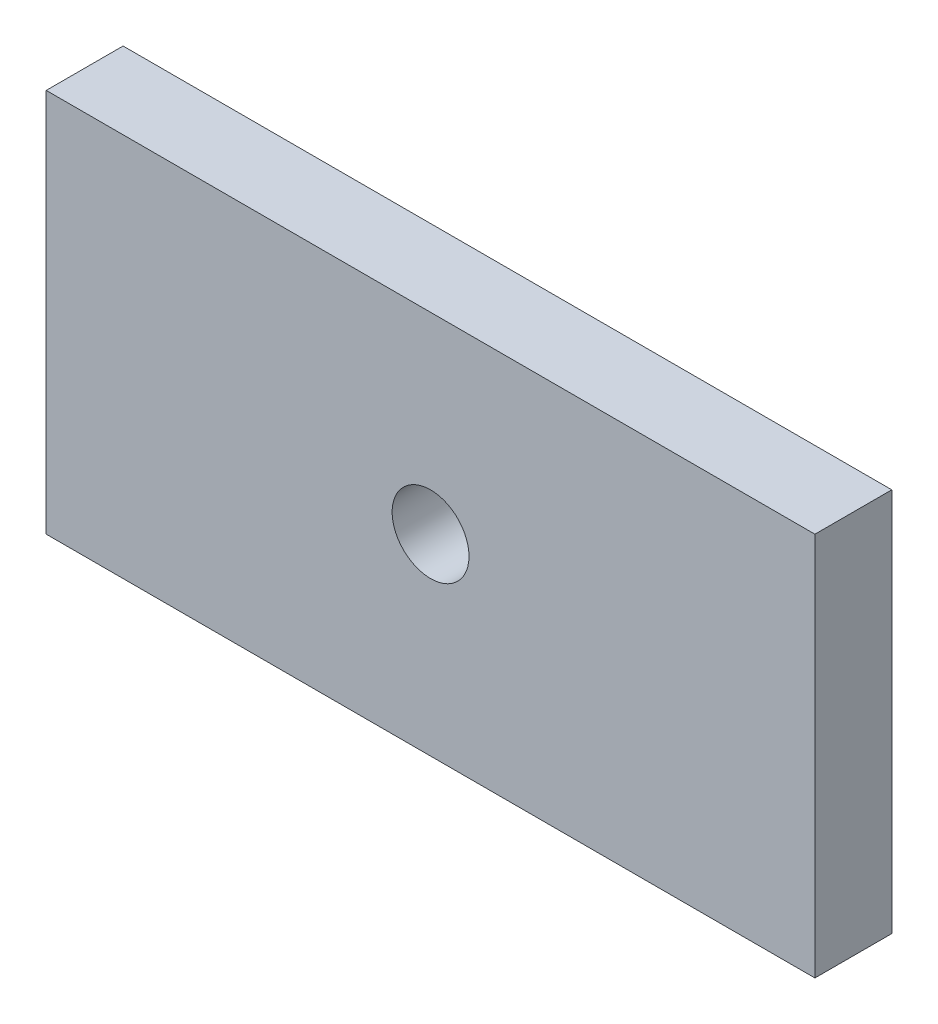
ISO-10303-21;
HEADER;
FILE_DESCRIPTION(('STEP AP214'),'2;1');
FILE_NAME('part.step','',(''),(''),'','','');
FILE_SCHEMA(('AUTOMOTIVE_DESIGN { 1 0 10303 214 1 1 1 1 }'));
ENDSEC;
DATA;
#1=APPLICATION_CONTEXT('core data for automotive mechanical design processes');
#2=APPLICATION_PROTOCOL_DEFINITION('international standard','automotive_design',2000,#1);
#3=PRODUCT_CONTEXT('',#1,'mechanical');
#4=PRODUCT('Part','Part','',(#3));
#5=PRODUCT_RELATED_PRODUCT_CATEGORY('part','',(#4));
#6=PRODUCT_DEFINITION_FORMATION('','',#4);
#7=PRODUCT_DEFINITION_CONTEXT('part definition',#1,'design');
#8=PRODUCT_DEFINITION('design','',#6,#7);
#9=PRODUCT_DEFINITION_SHAPE('','',#8);
#10=(LENGTH_UNIT() NAMED_UNIT(*) SI_UNIT(.MILLI.,.METRE.));
#11=(NAMED_UNIT(*) PLANE_ANGLE_UNIT() SI_UNIT($,.RADIAN.));
#12=(NAMED_UNIT(*) SI_UNIT($,.STERADIAN.) SOLID_ANGLE_UNIT());
#13=UNCERTAINTY_MEASURE_WITH_UNIT(LENGTH_MEASURE(1.E-05),#10,'distance_accuracy_value','');
#14=(GEOMETRIC_REPRESENTATION_CONTEXT(3) GLOBAL_UNCERTAINTY_ASSIGNED_CONTEXT((#13)) GLOBAL_UNIT_ASSIGNED_CONTEXT((#10,
#11,#12)) REPRESENTATION_CONTEXT('',''));
#15=CARTESIAN_POINT('',(0.,0.,0.));
#16=DIRECTION('',(0.,0.,1.));
#17=DIRECTION('',(1.,0.,0.));
#18=AXIS2_PLACEMENT_3D('',#15,#16,#17);
#19=CARTESIAN_POINT('',(0.,0.,10.));
#20=DIRECTION('',(0.,0.,-1.));
#21=DIRECTION('',(-1.,0.,0.));
#22=AXIS2_PLACEMENT_3D('',#19,#20,#21);
#23=PLANE('',#22);
#24=DIRECTION('',(0.,1.,0.));
#25=VECTOR('',#24,1.);
#26=CARTESIAN_POINT('',(50.,-25.,10.));
#27=LINE('',#26,#25);
#28=CARTESIAN_POINT('',(50.,-25.,10.));
#29=VERTEX_POINT('',#28);
#30=CARTESIAN_POINT('',(50.,25.,10.));
#31=VERTEX_POINT('',#30);
#32=EDGE_CURVE('E86',#29,#31,#27,.T.);
#33=ORIENTED_EDGE('',*,*,#32,.T.);
#34=DIRECTION('',(-1.,0.,0.));
#35=VECTOR('',#34,1.);
#36=CARTESIAN_POINT('',(-50.,25.,10.));
#37=LINE('',#36,#35);
#38=CARTESIAN_POINT('',(-50.,25.,10.));
#39=VERTEX_POINT('',#38);
#40=EDGE_CURVE('E81',#31,#39,#37,.T.);
#41=ORIENTED_EDGE('',*,*,#40,.T.);
#42=DIRECTION('',(0.,-1.,0.));
#43=VECTOR('',#42,1.);
#44=CARTESIAN_POINT('',(-50.,-25.,10.));
#45=LINE('',#44,#43);
#46=CARTESIAN_POINT('',(-50.,-25.,10.));
#47=VERTEX_POINT('',#46);
#48=EDGE_CURVE('E84',#39,#47,#45,.T.);
#49=ORIENTED_EDGE('',*,*,#48,.T.);
#50=DIRECTION('',(1.,0.,0.));
#51=VECTOR('',#50,1.);
#52=CARTESIAN_POINT('',(-50.,-25.,10.));
#53=LINE('',#52,#51);
#54=EDGE_CURVE('E51',#47,#29,#53,.T.);
#55=ORIENTED_EDGE('',*,*,#54,.T.);
#56=EDGE_LOOP('',(#33,#41,#49,#55));
#57=FACE_BOUND('',#56,.T.);
#58=CARTESIAN_POINT('',(0.,0.,10.));
#59=DIRECTION('',(0.,0.,1.));
#60=DIRECTION('',(1.,0.,0.));
#61=AXIS2_PLACEMENT_3D('',#58,#59,#60);
#62=CIRCLE('',#61,5.);
#63=CARTESIAN_POINT('',(4.99999999999999,0.,10.));
#64=VERTEX_POINT('',#63);
#65=EDGE_CURVE('E101',#64,#64,#62,.T.);
#66=ORIENTED_EDGE('',*,*,#65,.F.);
#67=EDGE_LOOP('',(#66));
#68=FACE_BOUND('',#67,.T.);
#69=ADVANCED_FACE('F34',(#57,#68),#23,.F.);
#70=CARTESIAN_POINT('',(0.,0.,0.));
#71=DIRECTION('',(0.,0.,-1.));
#72=DIRECTION('',(-1.,0.,0.));
#73=AXIS2_PLACEMENT_3D('',#70,#71,#72);
#74=PLANE('',#73);
#75=DIRECTION('',(0.,1.,0.));
#76=VECTOR('',#75,1.);
#77=CARTESIAN_POINT('',(50.,-25.,0.));
#78=LINE('',#77,#76);
#79=CARTESIAN_POINT('',(50.,-25.,0.));
#80=VERTEX_POINT('',#79);
#81=CARTESIAN_POINT('',(50.,25.,0.));
#82=VERTEX_POINT('',#81);
#83=EDGE_CURVE('E98',#80,#82,#78,.T.);
#84=ORIENTED_EDGE('',*,*,#83,.F.);
#85=DIRECTION('',(1.,0.,0.));
#86=VECTOR('',#85,1.);
#87=CARTESIAN_POINT('',(-50.,-25.,0.));
#88=LINE('',#87,#86);
#89=CARTESIAN_POINT('',(-50.,-25.,0.));
#90=VERTEX_POINT('',#89);
#91=EDGE_CURVE('E74',#90,#80,#88,.T.);
#92=ORIENTED_EDGE('',*,*,#91,.F.);
#93=DIRECTION('',(0.,-1.,0.));
#94=VECTOR('',#93,1.);
#95=CARTESIAN_POINT('',(-50.,-25.,0.));
#96=LINE('',#95,#94);
#97=CARTESIAN_POINT('',(-50.,25.,0.));
#98=VERTEX_POINT('',#97);
#99=EDGE_CURVE('E68',#98,#90,#96,.T.);
#100=ORIENTED_EDGE('',*,*,#99,.F.);
#101=DIRECTION('',(-1.,0.,0.));
#102=VECTOR('',#101,1.);
#103=CARTESIAN_POINT('',(-50.,25.,0.));
#104=LINE('',#103,#102);
#105=EDGE_CURVE('E90',#82,#98,#104,.T.);
#106=ORIENTED_EDGE('',*,*,#105,.F.);
#107=EDGE_LOOP('',(#84,#92,#100,#106));
#108=FACE_BOUND('',#107,.T.);
#109=CARTESIAN_POINT('',(0.,0.,0.));
#110=DIRECTION('',(0.,0.,1.));
#111=DIRECTION('',(1.,0.,0.));
#112=AXIS2_PLACEMENT_3D('',#109,#110,#111);
#113=CIRCLE('',#112,5.);
#114=CARTESIAN_POINT('',(4.99999999999999,0.,0.));
#115=VERTEX_POINT('',#114);
#116=EDGE_CURVE('E113',#115,#115,#113,.T.);
#117=ORIENTED_EDGE('',*,*,#116,.T.);
#118=EDGE_LOOP('',(#117));
#119=FACE_BOUND('',#118,.T.);
#120=ADVANCED_FACE('F109',(#108,#119),#74,.T.);
#121=CARTESIAN_POINT('',(50.,-25.,10.));
#122=DIRECTION('',(-1.,0.,0.));
#123=DIRECTION('',(0.,0.,1.));
#124=AXIS2_PLACEMENT_3D('',#121,#122,#123);
#125=PLANE('',#124);
#126=ORIENTED_EDGE('',*,*,#83,.T.);
#127=DIRECTION('',(0.,0.,-1.));
#128=VECTOR('',#127,1.);
#129=CARTESIAN_POINT('',(50.,25.,10.));
#130=LINE('',#129,#128);
#131=EDGE_CURVE('E11',#31,#82,#130,.T.);
#132=ORIENTED_EDGE('',*,*,#131,.F.);
#133=ORIENTED_EDGE('',*,*,#32,.F.);
#134=DIRECTION('',(0.,0.,-1.));
#135=VECTOR('',#134,1.);
#136=CARTESIAN_POINT('',(50.,-25.,10.));
#137=LINE('',#136,#135);
#138=EDGE_CURVE('E94',#29,#80,#137,.T.);
#139=ORIENTED_EDGE('',*,*,#138,.T.);
#140=EDGE_LOOP('',(#126,#132,#133,#139));
#141=FACE_BOUND('',#140,.T.);
#142=ADVANCED_FACE('F36',(#141),#125,.F.);
#143=CARTESIAN_POINT('',(-50.,25.,10.));
#144=DIRECTION('',(0.,-1.,0.));
#145=DIRECTION('',(0.,0.,-1.));
#146=AXIS2_PLACEMENT_3D('',#143,#144,#145);
#147=PLANE('',#146);
#148=ORIENTED_EDGE('',*,*,#105,.T.);
#149=DIRECTION('',(0.,0.,-1.));
#150=VECTOR('',#149,1.);
#151=CARTESIAN_POINT('',(-50.,25.,10.));
#152=LINE('',#151,#150);
#153=EDGE_CURVE('E43',#39,#98,#152,.T.);
#154=ORIENTED_EDGE('',*,*,#153,.F.);
#155=ORIENTED_EDGE('',*,*,#40,.F.);
#156=ORIENTED_EDGE('',*,*,#131,.T.);
#157=EDGE_LOOP('',(#148,#154,#155,#156));
#158=FACE_BOUND('',#157,.T.);
#159=ADVANCED_FACE('F89',(#158),#147,.F.);
#160=CARTESIAN_POINT('',(-50.,-25.,10.));
#161=DIRECTION('',(1.,0.,0.));
#162=DIRECTION('',(0.,0.,-1.));
#163=AXIS2_PLACEMENT_3D('',#160,#161,#162);
#164=PLANE('',#163);
#165=ORIENTED_EDGE('',*,*,#99,.T.);
#166=DIRECTION('',(0.,0.,-1.));
#167=VECTOR('',#166,1.);
#168=CARTESIAN_POINT('',(-50.,-25.,10.));
#169=LINE('',#168,#167);
#170=EDGE_CURVE('E91',#47,#90,#169,.T.);
#171=ORIENTED_EDGE('',*,*,#170,.F.);
#172=ORIENTED_EDGE('',*,*,#48,.F.);
#173=ORIENTED_EDGE('',*,*,#153,.T.);
#174=EDGE_LOOP('',(#165,#171,#172,#173));
#175=FACE_BOUND('',#174,.T.);
#176=ADVANCED_FACE('F92',(#175),#164,.F.);
#177=CARTESIAN_POINT('',(-50.,-25.,10.));
#178=DIRECTION('',(0.,1.,0.));
#179=DIRECTION('',(0.,0.,1.));
#180=AXIS2_PLACEMENT_3D('',#177,#178,#179);
#181=PLANE('',#180);
#182=ORIENTED_EDGE('',*,*,#91,.T.);
#183=ORIENTED_EDGE('',*,*,#138,.F.);
#184=ORIENTED_EDGE('',*,*,#54,.F.);
#185=ORIENTED_EDGE('',*,*,#170,.T.);
#186=EDGE_LOOP('',(#182,#183,#184,#185));
#187=FACE_BOUND('',#186,.T.);
#188=ADVANCED_FACE('F106',(#187),#181,.F.);
#189=CARTESIAN_POINT('',(0.,0.,10.));
#190=DIRECTION('',(0.,0.,-1.));
#191=DIRECTION('',(-1.,0.,0.));
#192=AXIS2_PLACEMENT_3D('',#189,#190,#191);
#193=CYLINDRICAL_SURFACE('',#192,5.);
#194=ORIENTED_EDGE('',*,*,#65,.T.);
#195=EDGE_LOOP('',(#194));
#196=FACE_BOUND('',#195,.T.);
#197=ORIENTED_EDGE('',*,*,#116,.F.);
#198=EDGE_LOOP('',(#197));
#199=FACE_BOUND('',#198,.T.);
#200=ADVANCED_FACE('F119',(#196,#199),#193,.F.);
#201=CLOSED_SHELL('',(#69,#120,#142,#159,#176,#188,#200));
#202=MANIFOLD_SOLID_BREP('B2',#201);
#203=ADVANCED_BREP_SHAPE_REPRESENTATION('',(#18,#202),#14);
#204=SHAPE_DEFINITION_REPRESENTATION(#9,#203);
ENDSEC;
END-ISO-10303-21;
